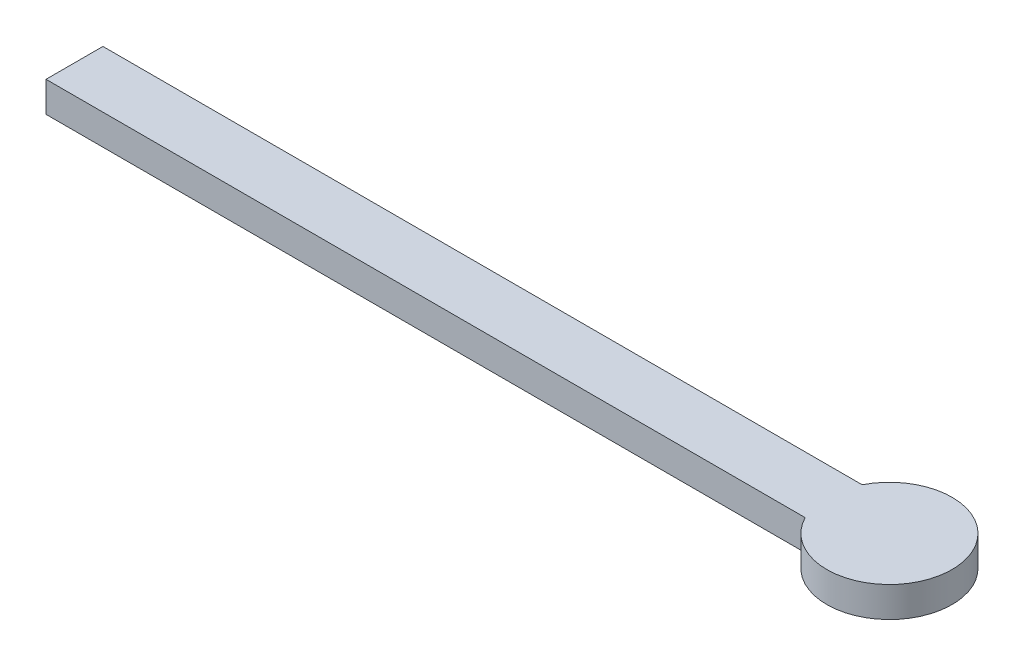
ISO-10303-21;
HEADER;
FILE_DESCRIPTION(('STEP AP214'),'2;1');
FILE_NAME('part.step','',(''),(''),'','','');
FILE_SCHEMA(('AUTOMOTIVE_DESIGN { 1 0 10303 214 1 1 1 1 }'));
ENDSEC;
DATA;
#1=APPLICATION_CONTEXT('core data for automotive mechanical design processes');
#2=APPLICATION_PROTOCOL_DEFINITION('international standard','automotive_design',2000,#1);
#3=PRODUCT_CONTEXT('',#1,'mechanical');
#4=PRODUCT('Part','Part','',(#3));
#5=PRODUCT_RELATED_PRODUCT_CATEGORY('part','',(#4));
#6=PRODUCT_DEFINITION_FORMATION('','',#4);
#7=PRODUCT_DEFINITION_CONTEXT('part definition',#1,'design');
#8=PRODUCT_DEFINITION('design','',#6,#7);
#9=PRODUCT_DEFINITION_SHAPE('','',#8);
#10=(LENGTH_UNIT() NAMED_UNIT(*) SI_UNIT(.MILLI.,.METRE.));
#11=(NAMED_UNIT(*) PLANE_ANGLE_UNIT() SI_UNIT($,.RADIAN.));
#12=(NAMED_UNIT(*) SI_UNIT($,.STERADIAN.) SOLID_ANGLE_UNIT());
#13=UNCERTAINTY_MEASURE_WITH_UNIT(LENGTH_MEASURE(1.E-05),#10,'distance_accuracy_value','');
#14=(GEOMETRIC_REPRESENTATION_CONTEXT(3) GLOBAL_UNCERTAINTY_ASSIGNED_CONTEXT((#13)) GLOBAL_UNIT_ASSIGNED_CONTEXT((#10,
#11,#12)) REPRESENTATION_CONTEXT('',''));
#15=CARTESIAN_POINT('',(0.,0.,0.));
#16=DIRECTION('',(0.,0.,1.));
#17=DIRECTION('',(1.,0.,0.));
#18=AXIS2_PLACEMENT_3D('',#15,#16,#17);
#19=CARTESIAN_POINT('',(-214.696938456699,8.,-7.49999999999998));
#20=DIRECTION('',(1.,0.,0.));
#21=DIRECTION('',(0.,0.,-1.));
#22=AXIS2_PLACEMENT_3D('',#19,#20,#21);
#23=PLANE('',#22);
#24=DIRECTION('',(0.,0.,1.));
#25=VECTOR('',#24,1.);
#26=CARTESIAN_POINT('',(-214.696938456699,0.,-7.49999999999998));
#27=LINE('',#26,#25);
#28=CARTESIAN_POINT('',(-214.696938456699,0.,-7.49999999999998));
#29=VERTEX_POINT('',#28);
#30=CARTESIAN_POINT('',(-214.696938456699,0.,7.50000000000002));
#31=VERTEX_POINT('',#30);
#32=EDGE_CURVE('E102',#29,#31,#27,.T.);
#33=ORIENTED_EDGE('',*,*,#32,.T.);
#34=DIRECTION('',(0.,-1.,0.));
#35=VECTOR('',#34,1.);
#36=CARTESIAN_POINT('',(-214.696938456699,8.,7.50000000000002));
#37=LINE('',#36,#35);
#38=CARTESIAN_POINT('',(-214.696938456699,8.,7.50000000000002));
#39=VERTEX_POINT('',#38);
#40=EDGE_CURVE('E11',#39,#31,#37,.T.);
#41=ORIENTED_EDGE('',*,*,#40,.F.);
#42=DIRECTION('',(0.,0.,1.));
#43=VECTOR('',#42,1.);
#44=CARTESIAN_POINT('',(-214.696938456699,8.,-7.49999999999998));
#45=LINE('',#44,#43);
#46=CARTESIAN_POINT('',(-214.696938456699,8.,-7.49999999999998));
#47=VERTEX_POINT('',#46);
#48=EDGE_CURVE('E90',#47,#39,#45,.T.);
#49=ORIENTED_EDGE('',*,*,#48,.F.);
#50=DIRECTION('',(0.,-1.,0.));
#51=VECTOR('',#50,1.);
#52=CARTESIAN_POINT('',(-214.696938456699,8.,-7.49999999999998));
#53=LINE('',#52,#51);
#54=EDGE_CURVE('E98',#47,#29,#53,.T.);
#55=ORIENTED_EDGE('',*,*,#54,.T.);
#56=EDGE_LOOP('',(#33,#41,#49,#55));
#57=FACE_BOUND('',#56,.T.);
#58=ADVANCED_FACE('F39',(#57),#23,.F.);
#59=CARTESIAN_POINT('',(-14.6969384566991,8.,7.5));
#60=DIRECTION('',(0.,0.,-1.));
#61=DIRECTION('',(-1.,0.,0.));
#62=AXIS2_PLACEMENT_3D('',#59,#60,#61);
#63=PLANE('',#62);
#64=DIRECTION('',(1.,0.,0.));
#65=VECTOR('',#64,1.);
#66=CARTESIAN_POINT('',(-14.6969384566991,0.,7.5));
#67=LINE('',#66,#65);
#68=CARTESIAN_POINT('',(-14.6969384566991,0.,7.5));
#69=VERTEX_POINT('',#68);
#70=EDGE_CURVE('E94',#31,#69,#67,.T.);
#71=ORIENTED_EDGE('',*,*,#70,.T.);
#72=DIRECTION('',(0.,-1.,0.));
#73=VECTOR('',#72,1.);
#74=CARTESIAN_POINT('',(-14.6969384566991,8.,7.5));
#75=LINE('',#74,#73);
#76=CARTESIAN_POINT('',(-14.6969384566991,8.,7.5));
#77=VERTEX_POINT('',#76);
#78=EDGE_CURVE('E47',#77,#69,#75,.T.);
#79=ORIENTED_EDGE('',*,*,#78,.F.);
#80=DIRECTION('',(1.,0.,0.));
#81=VECTOR('',#80,1.);
#82=CARTESIAN_POINT('',(-14.6969384566991,8.,7.5));
#83=LINE('',#82,#81);
#84=EDGE_CURVE('E85',#39,#77,#83,.T.);
#85=ORIENTED_EDGE('',*,*,#84,.F.);
#86=ORIENTED_EDGE('',*,*,#40,.T.);
#87=EDGE_LOOP('',(#71,#79,#85,#86));
#88=FACE_BOUND('',#87,.T.);
#89=ADVANCED_FACE('F93',(#88),#63,.F.);
#90=CARTESIAN_POINT('',(0.,8.,0.));
#91=DIRECTION('',(0.,-1.,0.));
#92=DIRECTION('',(0.,0.,-1.));
#93=AXIS2_PLACEMENT_3D('',#90,#91,#92);
#94=CYLINDRICAL_SURFACE('',#93,16.5);
#95=CARTESIAN_POINT('',(0.,0.,0.));
#96=DIRECTION('',(0.,1.,0.));
#97=DIRECTION('',(0.,0.,1.));
#98=AXIS2_PLACEMENT_3D('',#95,#96,#97);
#99=CIRCLE('',#98,16.5);
#100=CARTESIAN_POINT('',(-14.6969384566991,0.,-7.5));
#101=VERTEX_POINT('',#100);
#102=EDGE_CURVE('E72',#69,#101,#99,.T.);
#103=ORIENTED_EDGE('',*,*,#102,.T.);
#104=DIRECTION('',(0.,-1.,0.));
#105=VECTOR('',#104,1.);
#106=CARTESIAN_POINT('',(-14.6969384566991,8.,-7.5));
#107=LINE('',#106,#105);
#108=CARTESIAN_POINT('',(-14.6969384566991,8.,-7.5));
#109=VERTEX_POINT('',#108);
#110=EDGE_CURVE('E95',#109,#101,#107,.T.);
#111=ORIENTED_EDGE('',*,*,#110,.F.);
#112=CARTESIAN_POINT('',(0.,8.,0.));
#113=DIRECTION('',(0.,1.,0.));
#114=DIRECTION('',(0.,0.,1.));
#115=AXIS2_PLACEMENT_3D('',#112,#113,#114);
#116=CIRCLE('',#115,16.5);
#117=EDGE_CURVE('E88',#77,#109,#116,.T.);
#118=ORIENTED_EDGE('',*,*,#117,.F.);
#119=ORIENTED_EDGE('',*,*,#78,.T.);
#120=EDGE_LOOP('',(#103,#111,#118,#119));
#121=FACE_BOUND('',#120,.T.);
#122=ADVANCED_FACE('F96',(#121),#94,.T.);
#123=CARTESIAN_POINT('',(-14.6969384566991,8.,-7.5));
#124=DIRECTION('',(0.,0.,1.));
#125=DIRECTION('',(1.,0.,0.));
#126=AXIS2_PLACEMENT_3D('',#123,#124,#125);
#127=PLANE('',#126);
#128=DIRECTION('',(-1.,0.,0.));
#129=VECTOR('',#128,1.);
#130=CARTESIAN_POINT('',(-14.6969384566991,0.,-7.5));
#131=LINE('',#130,#129);
#132=EDGE_CURVE('E78',#101,#29,#131,.T.);
#133=ORIENTED_EDGE('',*,*,#132,.T.);
#134=ORIENTED_EDGE('',*,*,#54,.F.);
#135=DIRECTION('',(-1.,0.,0.));
#136=VECTOR('',#135,1.);
#137=CARTESIAN_POINT('',(-14.6969384566991,8.,-7.5));
#138=LINE('',#137,#136);
#139=EDGE_CURVE('E55',#109,#47,#138,.T.);
#140=ORIENTED_EDGE('',*,*,#139,.F.);
#141=ORIENTED_EDGE('',*,*,#110,.T.);
#142=EDGE_LOOP('',(#133,#134,#140,#141));
#143=FACE_BOUND('',#142,.T.);
#144=ADVANCED_FACE('F109',(#143),#127,.F.);
#145=CARTESIAN_POINT('',(0.,8.,0.));
#146=DIRECTION('',(0.,1.,0.));
#147=DIRECTION('',(0.,0.,1.));
#148=AXIS2_PLACEMENT_3D('',#145,#146,#147);
#149=PLANE('',#148);
#150=ORIENTED_EDGE('',*,*,#48,.T.);
#151=ORIENTED_EDGE('',*,*,#84,.T.);
#152=ORIENTED_EDGE('',*,*,#117,.T.);
#153=ORIENTED_EDGE('',*,*,#139,.T.);
#154=EDGE_LOOP('',(#150,#151,#152,#153));
#155=FACE_BOUND('',#154,.T.);
#156=ADVANCED_FACE('F86',(#155),#149,.T.);
#157=CARTESIAN_POINT('',(0.,0.,0.));
#158=DIRECTION('',(0.,1.,0.));
#159=DIRECTION('',(0.,0.,1.));
#160=AXIS2_PLACEMENT_3D('',#157,#158,#159);
#161=PLANE('',#160);
#162=ORIENTED_EDGE('',*,*,#32,.F.);
#163=ORIENTED_EDGE('',*,*,#132,.F.);
#164=ORIENTED_EDGE('',*,*,#102,.F.);
#165=ORIENTED_EDGE('',*,*,#70,.F.);
#166=EDGE_LOOP('',(#162,#163,#164,#165));
#167=FACE_BOUND('',#166,.T.);
#168=ADVANCED_FACE('F112',(#167),#161,.F.);
#169=CLOSED_SHELL('',(#58,#89,#122,#144,#156,#168));
#170=MANIFOLD_SOLID_BREP('B2',#169);
#171=ADVANCED_BREP_SHAPE_REPRESENTATION('',(#18,#170),#14);
#172=SHAPE_DEFINITION_REPRESENTATION(#9,#171);
ENDSEC;
END-ISO-10303-21;
